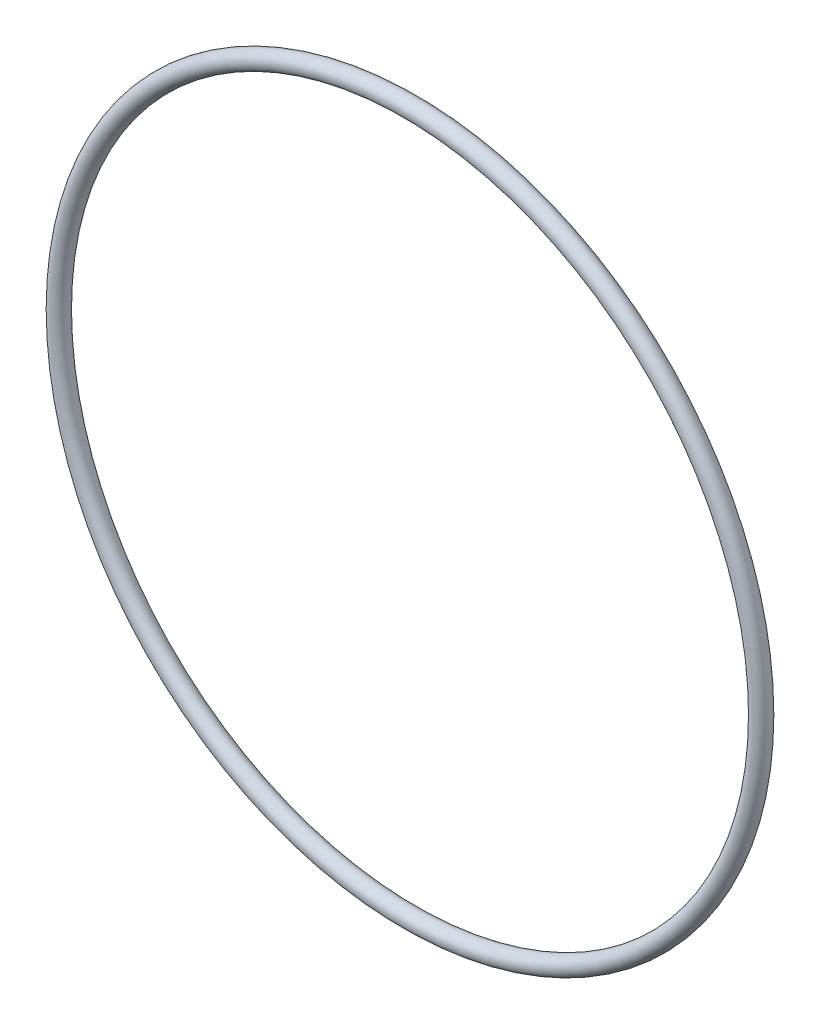
ISO-10303-21;
HEADER;
FILE_DESCRIPTION(('STEP AP214'),'2;1');
FILE_NAME('part.step','',(''),(''),'','','');
FILE_SCHEMA(('AUTOMOTIVE_DESIGN { 1 0 10303 214 1 1 1 1 }'));
ENDSEC;
DATA;
#1=APPLICATION_CONTEXT('core data for automotive mechanical design processes');
#2=APPLICATION_PROTOCOL_DEFINITION('international standard','automotive_design',2000,#1);
#3=PRODUCT_CONTEXT('',#1,'mechanical');
#4=PRODUCT('Part','Part','',(#3));
#5=PRODUCT_RELATED_PRODUCT_CATEGORY('part','',(#4));
#6=PRODUCT_DEFINITION_FORMATION('','',#4);
#7=PRODUCT_DEFINITION_CONTEXT('part definition',#1,'design');
#8=PRODUCT_DEFINITION('design','',#6,#7);
#9=PRODUCT_DEFINITION_SHAPE('','',#8);
#10=(LENGTH_UNIT() NAMED_UNIT(*) SI_UNIT(.MILLI.,.METRE.));
#11=(NAMED_UNIT(*) PLANE_ANGLE_UNIT() SI_UNIT($,.RADIAN.));
#12=(NAMED_UNIT(*) SI_UNIT($,.STERADIAN.) SOLID_ANGLE_UNIT());
#13=UNCERTAINTY_MEASURE_WITH_UNIT(LENGTH_MEASURE(1.E-05),#10,'distance_accuracy_value','');
#14=(GEOMETRIC_REPRESENTATION_CONTEXT(3) GLOBAL_UNCERTAINTY_ASSIGNED_CONTEXT((#13)) GLOBAL_UNIT_ASSIGNED_CONTEXT((#10,
#11,#12)) REPRESENTATION_CONTEXT('',''));
#15=CARTESIAN_POINT('',(0.,0.,0.));
#16=DIRECTION('',(0.,0.,1.));
#17=DIRECTION('',(1.,0.,0.));
#18=AXIS2_PLACEMENT_3D('',#15,#16,#17);
#19=CARTESIAN_POINT('',(0.,0.,0.));
#20=DIRECTION('',(0.,0.,1.));
#21=DIRECTION('',(1.,0.,0.));
#22=AXIS2_PLACEMENT_3D('',#19,#20,#21);
#23=TOROIDAL_SURFACE('',#22,59.69,1.524);
#24=CARTESIAN_POINT('',(59.69,0.,0.));
#25=DIRECTION('',(0.,1.,0.));
#26=DIRECTION('',(-1.,0.,0.));
#27=AXIS2_PLACEMENT_3D('',#24,#25,#26);
#28=CIRCLE('',#27,1.524);
#29=CARTESIAN_POINT('',(61.214,0.,0.));
#30=VERTEX_POINT('',#29);
#31=EDGE_CURVE('E11',#30,#30,#28,.T.);
#32=CARTESIAN_POINT('',(0.,0.,0.));
#33=DIRECTION('',(0.,0.,1.));
#34=DIRECTION('',(1.,0.,0.));
#35=AXIS2_PLACEMENT_3D('',#32,#33,#34);
#36=CIRCLE('',#35,61.214);
#37=EDGE_CURVE('',#30,#30,#36,.T.);
#38=ORIENTED_EDGE('',*,*,#31,.T.);
#39=ORIENTED_EDGE('',*,*,#31,.F.);
#40=ORIENTED_EDGE('',*,*,#37,.T.);
#41=ORIENTED_EDGE('',*,*,#37,.F.);
#42=EDGE_LOOP('',(#38,#40,#39,#41));
#43=FACE_BOUND('',#42,.T.);
#44=ADVANCED_FACE('F46',(#43),#23,.T.);
#45=CLOSED_SHELL('',(#44));
#46=MANIFOLD_SOLID_BREP('B2',#45);
#47=ADVANCED_BREP_SHAPE_REPRESENTATION('',(#18,#46),#14);
#48=SHAPE_DEFINITION_REPRESENTATION(#9,#47);
ENDSEC;
END-ISO-10303-21;
